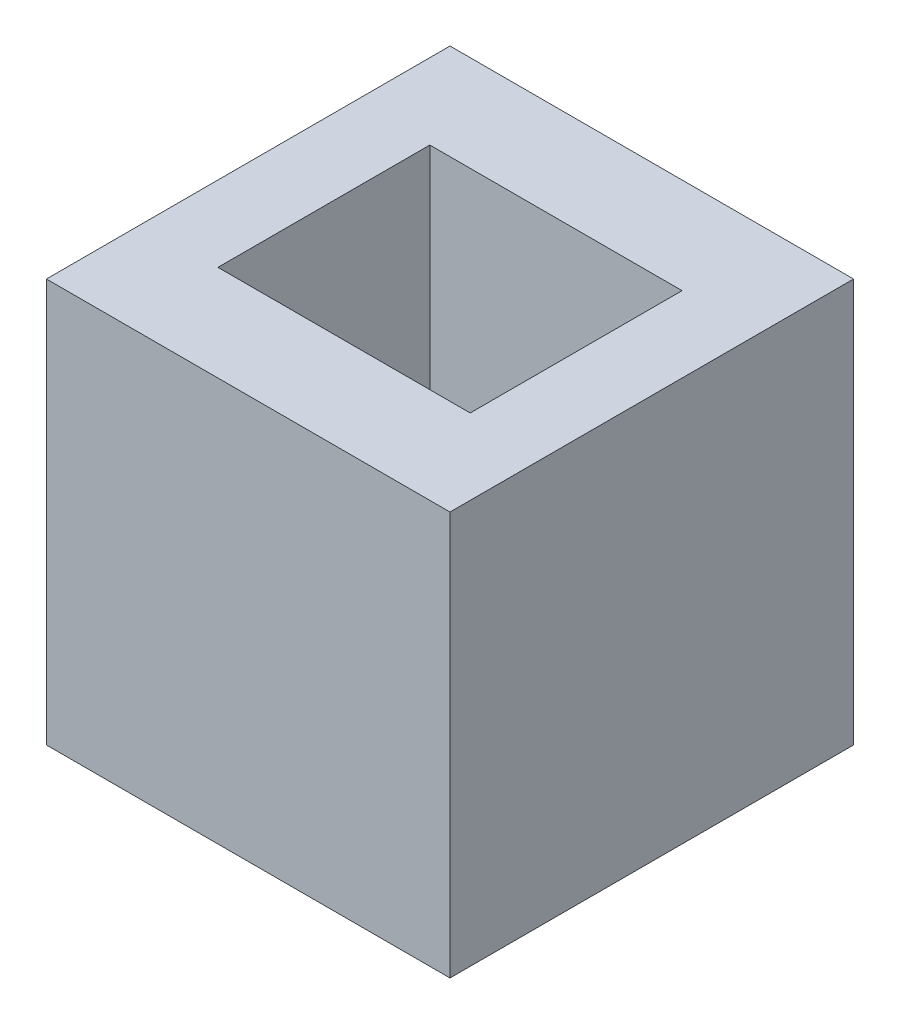
ISO-10303-21;
HEADER;
FILE_DESCRIPTION(('STEP AP214'),'2;1');
FILE_NAME('part.step','',(''),(''),'','','');
FILE_SCHEMA(('AUTOMOTIVE_DESIGN { 1 0 10303 214 1 1 1 1 }'));
ENDSEC;
DATA;
#1=APPLICATION_CONTEXT('core data for automotive mechanical design processes');
#2=APPLICATION_PROTOCOL_DEFINITION('international standard','automotive_design',2000,#1);
#3=PRODUCT_CONTEXT('',#1,'mechanical');
#4=PRODUCT('Part','Part','',(#3));
#5=PRODUCT_RELATED_PRODUCT_CATEGORY('part','',(#4));
#6=PRODUCT_DEFINITION_FORMATION('','',#4);
#7=PRODUCT_DEFINITION_CONTEXT('part definition',#1,'design');
#8=PRODUCT_DEFINITION('design','',#6,#7);
#9=PRODUCT_DEFINITION_SHAPE('','',#8);
#10=(LENGTH_UNIT() NAMED_UNIT(*) SI_UNIT(.MILLI.,.METRE.));
#11=(NAMED_UNIT(*) PLANE_ANGLE_UNIT() SI_UNIT($,.RADIAN.));
#12=(NAMED_UNIT(*) SI_UNIT($,.STERADIAN.) SOLID_ANGLE_UNIT());
#13=UNCERTAINTY_MEASURE_WITH_UNIT(LENGTH_MEASURE(1.E-05),#10,'distance_accuracy_value','');
#14=(GEOMETRIC_REPRESENTATION_CONTEXT(3) GLOBAL_UNCERTAINTY_ASSIGNED_CONTEXT((#13)) GLOBAL_UNIT_ASSIGNED_CONTEXT((#10,
#11,#12)) REPRESENTATION_CONTEXT('',''));
#15=CARTESIAN_POINT('',(0.,0.,0.));
#16=DIRECTION('',(0.,0.,1.));
#17=DIRECTION('',(1.,0.,0.));
#18=AXIS2_PLACEMENT_3D('',#15,#16,#17);
#19=CARTESIAN_POINT('',(0.,20.,0.));
#20=DIRECTION('',(0.,1.,0.));
#21=DIRECTION('',(0.,0.,1.));
#22=AXIS2_PLACEMENT_3D('',#19,#20,#21);
#23=PLANE('',#22);
#24=DIRECTION('',(0.,0.,1.));
#25=VECTOR('',#24,1.);
#26=CARTESIAN_POINT('',(-10.,20.,9.99999999999999));
#27=LINE('',#26,#25);
#28=CARTESIAN_POINT('',(-10.,20.,-10.));
#29=VERTEX_POINT('',#28);
#30=CARTESIAN_POINT('',(-10.,20.,9.99999999999999));
#31=VERTEX_POINT('',#30);
#32=EDGE_CURVE('E138',#29,#31,#27,.T.);
#33=ORIENTED_EDGE('',*,*,#32,.T.);
#34=DIRECTION('',(1.,0.,0.));
#35=VECTOR('',#34,1.);
#36=CARTESIAN_POINT('',(10.,20.,9.99999999999999));
#37=LINE('',#36,#35);
#38=CARTESIAN_POINT('',(10.,20.,9.99999999999999));
#39=VERTEX_POINT('',#38);
#40=EDGE_CURVE('E141',#31,#39,#37,.T.);
#41=ORIENTED_EDGE('',*,*,#40,.T.);
#42=DIRECTION('',(0.,0.,-1.));
#43=VECTOR('',#42,1.);
#44=CARTESIAN_POINT('',(10.,20.,9.99999999999999));
#45=LINE('',#44,#43);
#46=CARTESIAN_POINT('',(10.,20.,-10.));
#47=VERTEX_POINT('',#46);
#48=EDGE_CURVE('E144',#39,#47,#45,.T.);
#49=ORIENTED_EDGE('',*,*,#48,.T.);
#50=DIRECTION('',(-1.,0.,0.));
#51=VECTOR('',#50,1.);
#52=CARTESIAN_POINT('',(10.,20.,-10.));
#53=LINE('',#52,#51);
#54=EDGE_CURVE('E146',#47,#29,#53,.T.);
#55=ORIENTED_EDGE('',*,*,#54,.T.);
#56=EDGE_LOOP('',(#33,#41,#49,#55));
#57=FACE_BOUND('',#56,.T.);
#58=DIRECTION('',(1.,0.,0.));
#59=VECTOR('',#58,1.);
#60=CARTESIAN_POINT('',(6.25,20.,5.25));
#61=LINE('',#60,#59);
#62=CARTESIAN_POINT('',(-6.25,20.,5.25));
#63=VERTEX_POINT('',#62);
#64=CARTESIAN_POINT('',(6.25,20.,5.25));
#65=VERTEX_POINT('',#64);
#66=EDGE_CURVE('E110',#63,#65,#61,.T.);
#67=ORIENTED_EDGE('',*,*,#66,.F.);
#68=DIRECTION('',(0.,0.,1.));
#69=VECTOR('',#68,1.);
#70=CARTESIAN_POINT('',(-6.25,20.,5.25));
#71=LINE('',#70,#69);
#72=CARTESIAN_POINT('',(-6.25,20.,-5.25));
#73=VERTEX_POINT('',#72);
#74=EDGE_CURVE('E102',#73,#63,#71,.T.);
#75=ORIENTED_EDGE('',*,*,#74,.F.);
#76=DIRECTION('',(-1.,0.,0.));
#77=VECTOR('',#76,1.);
#78=CARTESIAN_POINT('',(6.25,20.,-5.25));
#79=LINE('',#78,#77);
#80=CARTESIAN_POINT('',(6.25,20.,-5.25));
#81=VERTEX_POINT('',#80);
#82=EDGE_CURVE('E124',#81,#73,#79,.T.);
#83=ORIENTED_EDGE('',*,*,#82,.F.);
#84=DIRECTION('',(0.,0.,-1.));
#85=VECTOR('',#84,1.);
#86=CARTESIAN_POINT('',(6.25,20.,5.25));
#87=LINE('',#86,#85);
#88=EDGE_CURVE('E122',#65,#81,#87,.T.);
#89=ORIENTED_EDGE('',*,*,#88,.F.);
#90=EDGE_LOOP('',(#67,#75,#83,#89));
#91=FACE_BOUND('',#90,.T.);
#92=ADVANCED_FACE('F37',(#57,#91),#23,.T.);
#93=CARTESIAN_POINT('',(0.,0.,0.));
#94=DIRECTION('',(0.,1.,0.));
#95=DIRECTION('',(0.,0.,1.));
#96=AXIS2_PLACEMENT_3D('',#93,#94,#95);
#97=PLANE('',#96);
#98=DIRECTION('',(0.,0.,1.));
#99=VECTOR('',#98,1.);
#100=CARTESIAN_POINT('',(-10.,0.,9.99999999999999));
#101=LINE('',#100,#99);
#102=CARTESIAN_POINT('',(-10.,0.,-10.));
#103=VERTEX_POINT('',#102);
#104=CARTESIAN_POINT('',(-10.,0.,9.99999999999999));
#105=VERTEX_POINT('',#104);
#106=EDGE_CURVE('E118',#103,#105,#101,.T.);
#107=ORIENTED_EDGE('',*,*,#106,.F.);
#108=DIRECTION('',(-1.,0.,0.));
#109=VECTOR('',#108,1.);
#110=CARTESIAN_POINT('',(10.,0.,-10.));
#111=LINE('',#110,#109);
#112=CARTESIAN_POINT('',(10.,0.,-10.));
#113=VERTEX_POINT('',#112);
#114=EDGE_CURVE('E142',#113,#103,#111,.T.);
#115=ORIENTED_EDGE('',*,*,#114,.F.);
#116=DIRECTION('',(0.,0.,-1.));
#117=VECTOR('',#116,1.);
#118=CARTESIAN_POINT('',(10.,0.,9.99999999999999));
#119=LINE('',#118,#117);
#120=CARTESIAN_POINT('',(10.,0.,9.99999999999999));
#121=VERTEX_POINT('',#120);
#122=EDGE_CURVE('E153',#121,#113,#119,.T.);
#123=ORIENTED_EDGE('',*,*,#122,.F.);
#124=DIRECTION('',(1.,0.,0.));
#125=VECTOR('',#124,1.);
#126=CARTESIAN_POINT('',(10.,0.,9.99999999999999));
#127=LINE('',#126,#125);
#128=EDGE_CURVE('E151',#105,#121,#127,.T.);
#129=ORIENTED_EDGE('',*,*,#128,.F.);
#130=EDGE_LOOP('',(#107,#115,#123,#129));
#131=FACE_BOUND('',#130,.T.);
#132=DIRECTION('',(0.,0.,1.));
#133=VECTOR('',#132,1.);
#134=CARTESIAN_POINT('',(-6.25,0.,5.25));
#135=LINE('',#134,#133);
#136=CARTESIAN_POINT('',(-6.25,0.,-5.25));
#137=VERTEX_POINT('',#136);
#138=CARTESIAN_POINT('',(-6.25,0.,5.25));
#139=VERTEX_POINT('',#138);
#140=EDGE_CURVE('E60',#137,#139,#135,.T.);
#141=ORIENTED_EDGE('',*,*,#140,.T.);
#142=DIRECTION('',(1.,0.,0.));
#143=VECTOR('',#142,1.);
#144=CARTESIAN_POINT('',(6.25,0.,5.25));
#145=LINE('',#144,#143);
#146=CARTESIAN_POINT('',(6.25,0.,5.25));
#147=VERTEX_POINT('',#146);
#148=EDGE_CURVE('E117',#139,#147,#145,.T.);
#149=ORIENTED_EDGE('',*,*,#148,.T.);
#150=DIRECTION('',(0.,0.,-1.));
#151=VECTOR('',#150,1.);
#152=CARTESIAN_POINT('',(6.25,0.,5.25));
#153=LINE('',#152,#151);
#154=CARTESIAN_POINT('',(6.25,0.,-5.25));
#155=VERTEX_POINT('',#154);
#156=EDGE_CURVE('E130',#147,#155,#153,.T.);
#157=ORIENTED_EDGE('',*,*,#156,.T.);
#158=DIRECTION('',(-1.,0.,0.));
#159=VECTOR('',#158,1.);
#160=CARTESIAN_POINT('',(6.25,0.,-5.25));
#161=LINE('',#160,#159);
#162=EDGE_CURVE('E111',#155,#137,#161,.T.);
#163=ORIENTED_EDGE('',*,*,#162,.T.);
#164=EDGE_LOOP('',(#141,#149,#157,#163));
#165=FACE_BOUND('',#164,.T.);
#166=ADVANCED_FACE('F171',(#131,#165),#97,.F.);
#167=CARTESIAN_POINT('',(-10.,20.,9.99999999999999));
#168=DIRECTION('',(1.,0.,0.));
#169=DIRECTION('',(0.,0.,-1.));
#170=AXIS2_PLACEMENT_3D('',#167,#168,#169);
#171=PLANE('',#170);
#172=ORIENTED_EDGE('',*,*,#106,.T.);
#173=DIRECTION('',(0.,-1.,0.));
#174=VECTOR('',#173,1.);
#175=CARTESIAN_POINT('',(-10.,20.,9.99999999999999));
#176=LINE('',#175,#174);
#177=EDGE_CURVE('E11',#31,#105,#176,.T.);
#178=ORIENTED_EDGE('',*,*,#177,.F.);
#179=ORIENTED_EDGE('',*,*,#32,.F.);
#180=DIRECTION('',(0.,-1.,0.));
#181=VECTOR('',#180,1.);
#182=CARTESIAN_POINT('',(-10.,20.,-10.));
#183=LINE('',#182,#181);
#184=EDGE_CURVE('E148',#29,#103,#183,.T.);
#185=ORIENTED_EDGE('',*,*,#184,.T.);
#186=EDGE_LOOP('',(#172,#178,#179,#185));
#187=FACE_BOUND('',#186,.T.);
#188=ADVANCED_FACE('F39',(#187),#171,.F.);
#189=CARTESIAN_POINT('',(10.,20.,9.99999999999999));
#190=DIRECTION('',(0.,0.,-1.));
#191=DIRECTION('',(-1.,0.,0.));
#192=AXIS2_PLACEMENT_3D('',#189,#190,#191);
#193=PLANE('',#192);
#194=ORIENTED_EDGE('',*,*,#128,.T.);
#195=DIRECTION('',(0.,-1.,0.));
#196=VECTOR('',#195,1.);
#197=CARTESIAN_POINT('',(10.,20.,9.99999999999999));
#198=LINE('',#197,#196);
#199=EDGE_CURVE('E45',#39,#121,#198,.T.);
#200=ORIENTED_EDGE('',*,*,#199,.F.);
#201=ORIENTED_EDGE('',*,*,#40,.F.);
#202=ORIENTED_EDGE('',*,*,#177,.T.);
#203=EDGE_LOOP('',(#194,#200,#201,#202));
#204=FACE_BOUND('',#203,.T.);
#205=ADVANCED_FACE('F181',(#204),#193,.F.);
#206=CARTESIAN_POINT('',(10.,20.,9.99999999999999));
#207=DIRECTION('',(-1.,0.,0.));
#208=DIRECTION('',(0.,0.,1.));
#209=AXIS2_PLACEMENT_3D('',#206,#207,#208);
#210=PLANE('',#209);
#211=ORIENTED_EDGE('',*,*,#122,.T.);
#212=DIRECTION('',(0.,-1.,0.));
#213=VECTOR('',#212,1.);
#214=CARTESIAN_POINT('',(10.,20.,-10.));
#215=LINE('',#214,#213);
#216=EDGE_CURVE('E158',#47,#113,#215,.T.);
#217=ORIENTED_EDGE('',*,*,#216,.F.);
#218=ORIENTED_EDGE('',*,*,#48,.F.);
#219=ORIENTED_EDGE('',*,*,#199,.T.);
#220=EDGE_LOOP('',(#211,#217,#218,#219));
#221=FACE_BOUND('',#220,.T.);
#222=ADVANCED_FACE('F165',(#221),#210,.F.);
#223=CARTESIAN_POINT('',(10.,20.,-10.));
#224=DIRECTION('',(0.,0.,1.));
#225=DIRECTION('',(1.,0.,0.));
#226=AXIS2_PLACEMENT_3D('',#223,#224,#225);
#227=PLANE('',#226);
#228=ORIENTED_EDGE('',*,*,#114,.T.);
#229=ORIENTED_EDGE('',*,*,#184,.F.);
#230=ORIENTED_EDGE('',*,*,#54,.F.);
#231=ORIENTED_EDGE('',*,*,#216,.T.);
#232=EDGE_LOOP('',(#228,#229,#230,#231));
#233=FACE_BOUND('',#232,.T.);
#234=ADVANCED_FACE('F175',(#233),#227,.F.);
#235=CARTESIAN_POINT('',(-6.25,20.,5.25));
#236=DIRECTION('',(1.,0.,0.));
#237=DIRECTION('',(0.,0.,-1.));
#238=AXIS2_PLACEMENT_3D('',#235,#236,#237);
#239=PLANE('',#238);
#240=ORIENTED_EDGE('',*,*,#140,.F.);
#241=DIRECTION('',(0.,-1.,0.));
#242=VECTOR('',#241,1.);
#243=CARTESIAN_POINT('',(-6.25,20.,-5.25));
#244=LINE('',#243,#242);
#245=EDGE_CURVE('E106',#73,#137,#244,.T.);
#246=ORIENTED_EDGE('',*,*,#245,.F.);
#247=ORIENTED_EDGE('',*,*,#74,.T.);
#248=DIRECTION('',(0.,-1.,0.));
#249=VECTOR('',#248,1.);
#250=CARTESIAN_POINT('',(-6.25,20.,5.25));
#251=LINE('',#250,#249);
#252=EDGE_CURVE('E105',#63,#139,#251,.T.);
#253=ORIENTED_EDGE('',*,*,#252,.T.);
#254=EDGE_LOOP('',(#240,#246,#247,#253));
#255=FACE_BOUND('',#254,.T.);
#256=ADVANCED_FACE('F104',(#255),#239,.T.);
#257=CARTESIAN_POINT('',(6.25,20.,5.25));
#258=DIRECTION('',(0.,0.,-1.));
#259=DIRECTION('',(-1.,0.,0.));
#260=AXIS2_PLACEMENT_3D('',#257,#258,#259);
#261=PLANE('',#260);
#262=ORIENTED_EDGE('',*,*,#148,.F.);
#263=ORIENTED_EDGE('',*,*,#252,.F.);
#264=ORIENTED_EDGE('',*,*,#66,.T.);
#265=DIRECTION('',(0.,-1.,0.));
#266=VECTOR('',#265,1.);
#267=CARTESIAN_POINT('',(6.25,20.,5.25));
#268=LINE('',#267,#266);
#269=EDGE_CURVE('E119',#65,#147,#268,.T.);
#270=ORIENTED_EDGE('',*,*,#269,.T.);
#271=EDGE_LOOP('',(#262,#263,#264,#270));
#272=FACE_BOUND('',#271,.T.);
#273=ADVANCED_FACE('F114',(#272),#261,.T.);
#274=CARTESIAN_POINT('',(6.25,20.,5.25));
#275=DIRECTION('',(-1.,0.,0.));
#276=DIRECTION('',(0.,0.,1.));
#277=AXIS2_PLACEMENT_3D('',#274,#275,#276);
#278=PLANE('',#277);
#279=ORIENTED_EDGE('',*,*,#156,.F.);
#280=ORIENTED_EDGE('',*,*,#269,.F.);
#281=ORIENTED_EDGE('',*,*,#88,.T.);
#282=DIRECTION('',(0.,-1.,0.));
#283=VECTOR('',#282,1.);
#284=CARTESIAN_POINT('',(6.25,20.,-5.25));
#285=LINE('',#284,#283);
#286=EDGE_CURVE('E52',#81,#155,#285,.T.);
#287=ORIENTED_EDGE('',*,*,#286,.T.);
#288=EDGE_LOOP('',(#279,#280,#281,#287));
#289=FACE_BOUND('',#288,.T.);
#290=ADVANCED_FACE('F204',(#289),#278,.T.);
#291=CARTESIAN_POINT('',(6.25,20.,-5.25));
#292=DIRECTION('',(0.,0.,1.));
#293=DIRECTION('',(1.,0.,0.));
#294=AXIS2_PLACEMENT_3D('',#291,#292,#293);
#295=PLANE('',#294);
#296=ORIENTED_EDGE('',*,*,#162,.F.);
#297=ORIENTED_EDGE('',*,*,#286,.F.);
#298=ORIENTED_EDGE('',*,*,#82,.T.);
#299=ORIENTED_EDGE('',*,*,#245,.T.);
#300=EDGE_LOOP('',(#296,#297,#298,#299));
#301=FACE_BOUND('',#300,.T.);
#302=ADVANCED_FACE('F208',(#301),#295,.T.);
#303=CLOSED_SHELL('',(#92,#166,#188,#205,#222,#234,#256,#273,#290,#302));
#304=MANIFOLD_SOLID_BREP('B2',#303);
#305=ADVANCED_BREP_SHAPE_REPRESENTATION('',(#18,#304),#14);
#306=SHAPE_DEFINITION_REPRESENTATION(#9,#305);
ENDSEC;
END-ISO-10303-21;
